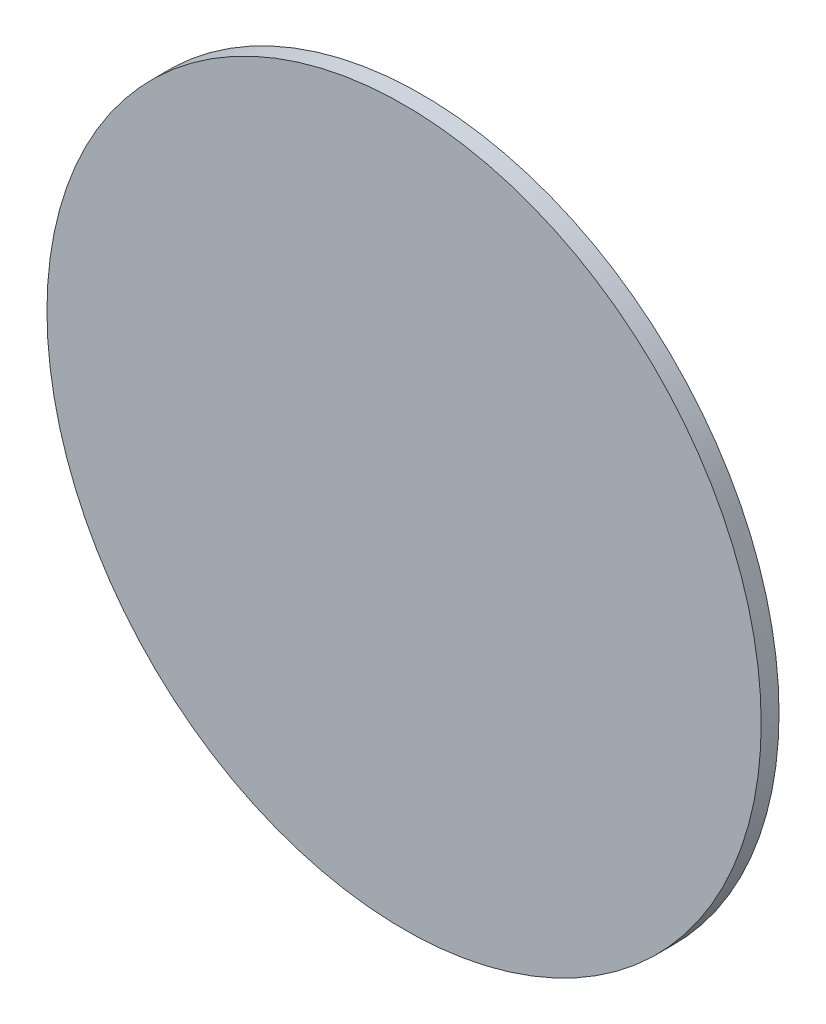
ISO-10303-21;
HEADER;
FILE_DESCRIPTION(('STEP AP214'),'2;1');
FILE_NAME('part.step','',(''),(''),'','','');
FILE_SCHEMA(('AUTOMOTIVE_DESIGN { 1 0 10303 214 1 1 1 1 }'));
ENDSEC;
DATA;
#1=APPLICATION_CONTEXT('core data for automotive mechanical design processes');
#2=APPLICATION_PROTOCOL_DEFINITION('international standard','automotive_design',2000,#1);
#3=PRODUCT_CONTEXT('',#1,'mechanical');
#4=PRODUCT('Part','Part','',(#3));
#5=PRODUCT_RELATED_PRODUCT_CATEGORY('part','',(#4));
#6=PRODUCT_DEFINITION_FORMATION('','',#4);
#7=PRODUCT_DEFINITION_CONTEXT('part definition',#1,'design');
#8=PRODUCT_DEFINITION('design','',#6,#7);
#9=PRODUCT_DEFINITION_SHAPE('','',#8);
#10=(LENGTH_UNIT() NAMED_UNIT(*) SI_UNIT(.MILLI.,.METRE.));
#11=(NAMED_UNIT(*) PLANE_ANGLE_UNIT() SI_UNIT($,.RADIAN.));
#12=(NAMED_UNIT(*) SI_UNIT($,.STERADIAN.) SOLID_ANGLE_UNIT());
#13=UNCERTAINTY_MEASURE_WITH_UNIT(LENGTH_MEASURE(1.E-05),#10,'distance_accuracy_value','');
#14=(GEOMETRIC_REPRESENTATION_CONTEXT(3) GLOBAL_UNCERTAINTY_ASSIGNED_CONTEXT((#13)) GLOBAL_UNIT_ASSIGNED_CONTEXT((#10,
#11,#12)) REPRESENTATION_CONTEXT('',''));
#15=CARTESIAN_POINT('',(0.,0.,0.));
#16=DIRECTION('',(0.,0.,1.));
#17=DIRECTION('',(1.,0.,0.));
#18=AXIS2_PLACEMENT_3D('',#15,#16,#17);
#19=CARTESIAN_POINT('',(0.,0.,1.));
#20=DIRECTION('',(0.,0.,-1.));
#21=DIRECTION('',(-1.,0.,0.));
#22=AXIS2_PLACEMENT_3D('',#19,#20,#21);
#23=CYLINDRICAL_SURFACE('',#22,20.);
#24=CARTESIAN_POINT('',(0.,0.,1.));
#25=DIRECTION('',(0.,0.,1.));
#26=DIRECTION('',(1.,0.,0.));
#27=AXIS2_PLACEMENT_3D('',#24,#25,#26);
#28=CIRCLE('',#27,20.);
#29=CARTESIAN_POINT('',(20.,0.,1.));
#30=VERTEX_POINT('',#29);
#31=EDGE_CURVE('E10',#30,#30,#28,.T.);
#32=ORIENTED_EDGE('',*,*,#31,.F.);
#33=EDGE_LOOP('',(#32));
#34=FACE_BOUND('',#33,.T.);
#35=CARTESIAN_POINT('',(0.,0.,0.));
#36=DIRECTION('',(0.,0.,1.));
#37=DIRECTION('',(1.,0.,0.));
#38=AXIS2_PLACEMENT_3D('',#35,#36,#37);
#39=CIRCLE('',#38,20.);
#40=CARTESIAN_POINT('',(20.,0.,0.));
#41=VERTEX_POINT('',#40);
#42=EDGE_CURVE('E34',#41,#41,#39,.T.);
#43=ORIENTED_EDGE('',*,*,#42,.T.);
#44=EDGE_LOOP('',(#43));
#45=FACE_BOUND('',#44,.T.);
#46=ADVANCED_FACE('F31',(#34,#45),#23,.T.);
#47=CARTESIAN_POINT('',(0.,0.,1.));
#48=DIRECTION('',(0.,0.,1.));
#49=DIRECTION('',(1.,0.,0.));
#50=AXIS2_PLACEMENT_3D('',#47,#48,#49);
#51=PLANE('',#50);
#52=ORIENTED_EDGE('',*,*,#31,.T.);
#53=EDGE_LOOP('',(#52));
#54=FACE_BOUND('',#53,.T.);
#55=ADVANCED_FACE('F46',(#54),#51,.T.);
#56=CARTESIAN_POINT('',(0.,0.,0.));
#57=DIRECTION('',(0.,0.,1.));
#58=DIRECTION('',(1.,0.,0.));
#59=AXIS2_PLACEMENT_3D('',#56,#57,#58);
#60=PLANE('',#59);
#61=ORIENTED_EDGE('',*,*,#42,.F.);
#62=EDGE_LOOP('',(#61));
#63=FACE_BOUND('',#62,.T.);
#64=ADVANCED_FACE('F44',(#63),#60,.F.);
#65=CLOSED_SHELL('',(#46,#55,#64));
#66=MANIFOLD_SOLID_BREP('B2',#65);
#67=ADVANCED_BREP_SHAPE_REPRESENTATION('',(#18,#66),#14);
#68=SHAPE_DEFINITION_REPRESENTATION(#9,#67);
ENDSEC;
END-ISO-10303-21;
